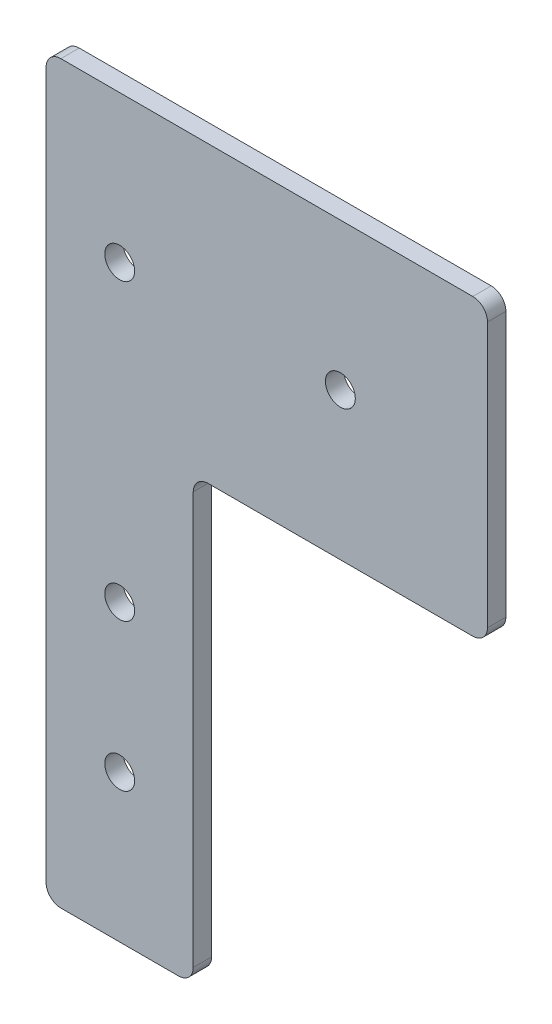
ISO-10303-21;
HEADER;
FILE_DESCRIPTION(('STEP AP214'),'2;1');
FILE_NAME('part.step','',(''),(''),'','','');
FILE_SCHEMA(('AUTOMOTIVE_DESIGN { 1 0 10303 214 1 1 1 1 }'));
ENDSEC;
DATA;
#1=APPLICATION_CONTEXT('core data for automotive mechanical design processes');
#2=APPLICATION_PROTOCOL_DEFINITION('international standard','automotive_design',2000,#1);
#3=PRODUCT_CONTEXT('',#1,'mechanical');
#4=PRODUCT('Part','Part','',(#3));
#5=PRODUCT_RELATED_PRODUCT_CATEGORY('part','',(#4));
#6=PRODUCT_DEFINITION_FORMATION('','',#4);
#7=PRODUCT_DEFINITION_CONTEXT('part definition',#1,'design');
#8=PRODUCT_DEFINITION('design','',#6,#7);
#9=PRODUCT_DEFINITION_SHAPE('','',#8);
#10=(LENGTH_UNIT() NAMED_UNIT(*) SI_UNIT(.MILLI.,.METRE.));
#11=(NAMED_UNIT(*) PLANE_ANGLE_UNIT() SI_UNIT($,.RADIAN.));
#12=(NAMED_UNIT(*) SI_UNIT($,.STERADIAN.) SOLID_ANGLE_UNIT());
#13=UNCERTAINTY_MEASURE_WITH_UNIT(LENGTH_MEASURE(1.E-05),#10,'distance_accuracy_value','');
#14=(GEOMETRIC_REPRESENTATION_CONTEXT(3) GLOBAL_UNCERTAINTY_ASSIGNED_CONTEXT((#13)) GLOBAL_UNIT_ASSIGNED_CONTEXT((#10,
#11,#12)) REPRESENTATION_CONTEXT('',''));
#15=CARTESIAN_POINT('',(0.,0.,0.));
#16=DIRECTION('',(0.,0.,1.));
#17=DIRECTION('',(1.,0.,0.));
#18=AXIS2_PLACEMENT_3D('',#15,#16,#17);
#19=CARTESIAN_POINT('',(-12.7,63.5,3.175));
#20=DIRECTION('',(0.,-1.,0.));
#21=DIRECTION('',(0.,0.,-1.));
#22=AXIS2_PLACEMENT_3D('',#19,#20,#21);
#23=PLANE('',#22);
#24=DIRECTION('',(-1.,0.,0.));
#25=VECTOR('',#24,1.);
#26=CARTESIAN_POINT('',(-12.7,63.5,0.));
#27=LINE('',#26,#25);
#28=CARTESIAN_POINT('',(60.96,63.5,0.));
#29=VERTEX_POINT('',#28);
#30=CARTESIAN_POINT('',(-10.16,63.5,0.));
#31=VERTEX_POINT('',#30);
#32=EDGE_CURVE('E149',#29,#31,#27,.T.);
#33=ORIENTED_EDGE('',*,*,#32,.T.);
#34=DIRECTION('',(0.,0.,-1.));
#35=VECTOR('',#34,1.);
#36=CARTESIAN_POINT('',(-10.16,63.5,3.175));
#37=LINE('',#36,#35);
#38=CARTESIAN_POINT('',(-10.16,63.5,3.175));
#39=VERTEX_POINT('',#38);
#40=EDGE_CURVE('E127',#31,#39,#37,.F.);
#41=ORIENTED_EDGE('',*,*,#40,.T.);
#42=DIRECTION('',(-1.,0.,0.));
#43=VECTOR('',#42,1.);
#44=CARTESIAN_POINT('',(12.7,63.5,3.175));
#45=LINE('',#44,#43);
#46=CARTESIAN_POINT('',(60.96,63.5,3.175));
#47=VERTEX_POINT('',#46);
#48=EDGE_CURVE('E165',#47,#39,#45,.T.);
#49=ORIENTED_EDGE('',*,*,#48,.F.);
#50=DIRECTION('',(0.,0.,-1.));
#51=VECTOR('',#50,1.);
#52=CARTESIAN_POINT('',(60.96,63.5,3.175));
#53=LINE('',#52,#51);
#54=EDGE_CURVE('E132',#47,#29,#53,.T.);
#55=ORIENTED_EDGE('',*,*,#54,.T.);
#56=EDGE_LOOP('',(#33,#41,#49,#55));
#57=FACE_BOUND('',#56,.T.);
#58=ADVANCED_FACE('F32',(#57),#23,.F.);
#59=CARTESIAN_POINT('',(-12.7,-63.5,3.175));
#60=DIRECTION('',(1.,0.,0.));
#61=DIRECTION('',(0.,0.,-1.));
#62=AXIS2_PLACEMENT_3D('',#59,#60,#61);
#63=PLANE('',#62);
#64=DIRECTION('',(0.,-1.,0.));
#65=VECTOR('',#64,1.);
#66=CARTESIAN_POINT('',(-12.7,-63.5,3.175));
#67=LINE('',#66,#65);
#68=CARTESIAN_POINT('',(-12.7,60.96,3.175));
#69=VERTEX_POINT('',#68);
#70=CARTESIAN_POINT('',(-12.7,-60.96,3.175));
#71=VERTEX_POINT('',#70);
#72=EDGE_CURVE('E142',#69,#71,#67,.T.);
#73=ORIENTED_EDGE('',*,*,#72,.F.);
#74=DIRECTION('',(0.,0.,-1.));
#75=VECTOR('',#74,1.);
#76=CARTESIAN_POINT('',(-12.7,60.96,3.175));
#77=LINE('',#76,#75);
#78=CARTESIAN_POINT('',(-12.7,60.96,0.));
#79=VERTEX_POINT('',#78);
#80=EDGE_CURVE('E126',#69,#79,#77,.T.);
#81=ORIENTED_EDGE('',*,*,#80,.T.);
#82=DIRECTION('',(0.,-1.,0.));
#83=VECTOR('',#82,1.);
#84=CARTESIAN_POINT('',(-12.7,-63.5,0.));
#85=LINE('',#84,#83);
#86=CARTESIAN_POINT('',(-12.7,-60.96,0.));
#87=VERTEX_POINT('',#86);
#88=EDGE_CURVE('E139',#79,#87,#85,.T.);
#89=ORIENTED_EDGE('',*,*,#88,.T.);
#90=DIRECTION('',(0.,0.,-1.));
#91=VECTOR('',#90,1.);
#92=CARTESIAN_POINT('',(-12.7,-60.96,3.175));
#93=LINE('',#92,#91);
#94=EDGE_CURVE('E144',#87,#71,#93,.F.);
#95=ORIENTED_EDGE('',*,*,#94,.T.);
#96=EDGE_LOOP('',(#73,#81,#89,#95));
#97=FACE_BOUND('',#96,.T.);
#98=ADVANCED_FACE('F138',(#97),#63,.F.);
#99=CARTESIAN_POINT('',(-12.7,-63.5,3.175));
#100=DIRECTION('',(0.,1.,0.));
#101=DIRECTION('',(0.,0.,1.));
#102=AXIS2_PLACEMENT_3D('',#99,#100,#101);
#103=PLANE('',#102);
#104=DIRECTION('',(1.,0.,0.));
#105=VECTOR('',#104,1.);
#106=CARTESIAN_POINT('',(-12.7,-63.5,3.175));
#107=LINE('',#106,#105);
#108=CARTESIAN_POINT('',(-10.16,-63.5,3.175));
#109=VERTEX_POINT('',#108);
#110=CARTESIAN_POINT('',(10.16,-63.5,3.175));
#111=VERTEX_POINT('',#110);
#112=EDGE_CURVE('E225',#109,#111,#107,.T.);
#113=ORIENTED_EDGE('',*,*,#112,.F.);
#114=DIRECTION('',(0.,0.,-1.));
#115=VECTOR('',#114,1.);
#116=CARTESIAN_POINT('',(-10.16,-63.5,3.175));
#117=LINE('',#116,#115);
#118=CARTESIAN_POINT('',(-10.16,-63.5,0.));
#119=VERTEX_POINT('',#118);
#120=EDGE_CURVE('E188',#109,#119,#117,.T.);
#121=ORIENTED_EDGE('',*,*,#120,.T.);
#122=DIRECTION('',(1.,0.,0.));
#123=VECTOR('',#122,1.);
#124=CARTESIAN_POINT('',(-12.7,-63.5,0.));
#125=LINE('',#124,#123);
#126=CARTESIAN_POINT('',(10.16,-63.5,0.));
#127=VERTEX_POINT('',#126);
#128=EDGE_CURVE('E148',#119,#127,#125,.T.);
#129=ORIENTED_EDGE('',*,*,#128,.T.);
#130=DIRECTION('',(0.,0.,-1.));
#131=VECTOR('',#130,1.);
#132=CARTESIAN_POINT('',(10.16,-63.5,3.175));
#133=LINE('',#132,#131);
#134=EDGE_CURVE('E186',#127,#111,#133,.F.);
#135=ORIENTED_EDGE('',*,*,#134,.T.);
#136=EDGE_LOOP('',(#113,#121,#129,#135));
#137=FACE_BOUND('',#136,.T.);
#138=ADVANCED_FACE('F294',(#137),#103,.F.);
#139=CARTESIAN_POINT('',(12.7,-63.5,3.175));
#140=DIRECTION('',(-1.,0.,0.));
#141=DIRECTION('',(0.,-1.,0.));
#142=AXIS2_PLACEMENT_3D('',#139,#140,#141);
#143=PLANE('',#142);
#144=DIRECTION('',(0.,1.,0.));
#145=VECTOR('',#144,1.);
#146=CARTESIAN_POINT('',(12.7,-63.5,3.175));
#147=LINE('',#146,#145);
#148=CARTESIAN_POINT('',(12.7,-60.96,3.175));
#149=VERTEX_POINT('',#148);
#150=CARTESIAN_POINT('',(12.7,10.16,3.175));
#151=VERTEX_POINT('',#150);
#152=EDGE_CURVE('E220',#149,#151,#147,.T.);
#153=ORIENTED_EDGE('',*,*,#152,.F.);
#154=DIRECTION('',(0.,0.,-1.));
#155=VECTOR('',#154,1.);
#156=CARTESIAN_POINT('',(12.7,-60.96,3.175));
#157=LINE('',#156,#155);
#158=CARTESIAN_POINT('',(12.7,-60.96,0.));
#159=VERTEX_POINT('',#158);
#160=EDGE_CURVE('E193',#149,#159,#157,.T.);
#161=ORIENTED_EDGE('',*,*,#160,.T.);
#162=DIRECTION('',(0.,1.,0.));
#163=VECTOR('',#162,1.);
#164=CARTESIAN_POINT('',(12.7,-63.5,0.));
#165=LINE('',#164,#163);
#166=CARTESIAN_POINT('',(12.7,10.16,0.));
#167=VERTEX_POINT('',#166);
#168=EDGE_CURVE('E152',#159,#167,#165,.T.);
#169=ORIENTED_EDGE('',*,*,#168,.T.);
#170=DIRECTION('',(0.,0.,-1.));
#171=VECTOR('',#170,1.);
#172=CARTESIAN_POINT('',(12.7,10.16,3.175));
#173=LINE('',#172,#171);
#174=EDGE_CURVE('E191',#167,#151,#173,.F.);
#175=ORIENTED_EDGE('',*,*,#174,.T.);
#176=EDGE_LOOP('',(#153,#161,#169,#175));
#177=FACE_BOUND('',#176,.T.);
#178=ADVANCED_FACE('F211',(#177),#143,.F.);
#179=CARTESIAN_POINT('',(12.7,12.7,3.175));
#180=DIRECTION('',(0.,1.,0.));
#181=DIRECTION('',(0.,0.,1.));
#182=AXIS2_PLACEMENT_3D('',#179,#180,#181);
#183=PLANE('',#182);
#184=DIRECTION('',(1.,0.,0.));
#185=VECTOR('',#184,1.);
#186=CARTESIAN_POINT('',(12.7,12.7,3.175));
#187=LINE('',#186,#185);
#188=CARTESIAN_POINT('',(15.24,12.7,3.175));
#189=VERTEX_POINT('',#188);
#190=CARTESIAN_POINT('',(60.96,12.7,3.175));
#191=VERTEX_POINT('',#190);
#192=EDGE_CURVE('E219',#189,#191,#187,.T.);
#193=ORIENTED_EDGE('',*,*,#192,.F.);
#194=DIRECTION('',(0.,0.,-1.));
#195=VECTOR('',#194,1.);
#196=CARTESIAN_POINT('',(15.24,12.7,0.));
#197=LINE('',#196,#195);
#198=CARTESIAN_POINT('',(15.24,12.7,0.));
#199=VERTEX_POINT('',#198);
#200=EDGE_CURVE('E198',#189,#199,#197,.T.);
#201=ORIENTED_EDGE('',*,*,#200,.T.);
#202=DIRECTION('',(1.,0.,0.));
#203=VECTOR('',#202,1.);
#204=CARTESIAN_POINT('',(12.7,12.7,0.));
#205=LINE('',#204,#203);
#206=CARTESIAN_POINT('',(60.96,12.7,0.));
#207=VERTEX_POINT('',#206);
#208=EDGE_CURVE('E160',#199,#207,#205,.T.);
#209=ORIENTED_EDGE('',*,*,#208,.T.);
#210=DIRECTION('',(0.,0.,-1.));
#211=VECTOR('',#210,1.);
#212=CARTESIAN_POINT('',(60.96,12.7,3.175));
#213=LINE('',#212,#211);
#214=EDGE_CURVE('E196',#207,#191,#213,.F.);
#215=ORIENTED_EDGE('',*,*,#214,.T.);
#216=EDGE_LOOP('',(#193,#201,#209,#215));
#217=FACE_BOUND('',#216,.T.);
#218=ADVANCED_FACE('F222',(#217),#183,.F.);
#219=CARTESIAN_POINT('',(63.5,63.5,3.175));
#220=DIRECTION('',(-1.,0.,0.));
#221=DIRECTION('',(0.,0.,1.));
#222=AXIS2_PLACEMENT_3D('',#219,#220,#221);
#223=PLANE('',#222);
#224=DIRECTION('',(0.,1.,0.));
#225=VECTOR('',#224,1.);
#226=CARTESIAN_POINT('',(63.5,63.5,3.175));
#227=LINE('',#226,#225);
#228=CARTESIAN_POINT('',(63.5,15.24,3.175));
#229=VERTEX_POINT('',#228);
#230=CARTESIAN_POINT('',(63.5,60.96,3.175));
#231=VERTEX_POINT('',#230);
#232=EDGE_CURVE('E166',#229,#231,#227,.T.);
#233=ORIENTED_EDGE('',*,*,#232,.F.);
#234=DIRECTION('',(0.,0.,-1.));
#235=VECTOR('',#234,1.);
#236=CARTESIAN_POINT('',(63.5,15.24,3.175));
#237=LINE('',#236,#235);
#238=CARTESIAN_POINT('',(63.5,15.24,0.));
#239=VERTEX_POINT('',#238);
#240=EDGE_CURVE('E202',#229,#239,#237,.T.);
#241=ORIENTED_EDGE('',*,*,#240,.T.);
#242=DIRECTION('',(0.,1.,0.));
#243=VECTOR('',#242,1.);
#244=CARTESIAN_POINT('',(63.5,63.5,0.));
#245=LINE('',#244,#243);
#246=CARTESIAN_POINT('',(63.5,60.96,0.));
#247=VERTEX_POINT('',#246);
#248=EDGE_CURVE('E163',#239,#247,#245,.T.);
#249=ORIENTED_EDGE('',*,*,#248,.T.);
#250=DIRECTION('',(0.,0.,-1.));
#251=VECTOR('',#250,1.);
#252=CARTESIAN_POINT('',(63.5,60.96,3.175));
#253=LINE('',#252,#251);
#254=EDGE_CURVE('E47',#247,#231,#253,.F.);
#255=ORIENTED_EDGE('',*,*,#254,.T.);
#256=EDGE_LOOP('',(#233,#241,#249,#255));
#257=FACE_BOUND('',#256,.T.);
#258=ADVANCED_FACE('F267',(#257),#223,.F.);
#259=CARTESIAN_POINT('',(0.,0.,3.175));
#260=DIRECTION('',(0.,0.,-1.));
#261=DIRECTION('',(-1.,0.,0.));
#262=AXIS2_PLACEMENT_3D('',#259,#260,#261);
#263=PLANE('',#262);
#264=CARTESIAN_POINT('',(38.1,38.1,3.175));
#265=DIRECTION('',(0.,0.,1.));
#266=DIRECTION('',(1.,0.,0.));
#267=AXIS2_PLACEMENT_3D('',#264,#265,#266);
#268=CIRCLE('',#267,2.5796875);
#269=CARTESIAN_POINT('',(40.6796875,38.1,3.175));
#270=VERTEX_POINT('',#269);
#271=EDGE_CURVE('E250',#270,#270,#268,.T.);
#272=ORIENTED_EDGE('',*,*,#271,.F.);
#273=EDGE_LOOP('',(#272));
#274=FACE_BOUND('',#273,.T.);
#275=CARTESIAN_POINT('',(0.,-38.1,3.175));
#276=DIRECTION('',(0.,0.,1.));
#277=DIRECTION('',(1.,0.,0.));
#278=AXIS2_PLACEMENT_3D('',#275,#276,#277);
#279=CIRCLE('',#278,2.5796875);
#280=CARTESIAN_POINT('',(2.5796875,-38.1,3.175));
#281=VERTEX_POINT('',#280);
#282=EDGE_CURVE('E244',#281,#281,#279,.T.);
#283=ORIENTED_EDGE('',*,*,#282,.F.);
#284=EDGE_LOOP('',(#283));
#285=FACE_BOUND('',#284,.T.);
#286=CARTESIAN_POINT('',(0.,-12.7,3.175));
#287=DIRECTION('',(0.,0.,1.));
#288=DIRECTION('',(1.,0.,0.));
#289=AXIS2_PLACEMENT_3D('',#286,#287,#288);
#290=CIRCLE('',#289,2.5796875);
#291=CARTESIAN_POINT('',(2.5796875,-12.7,3.175));
#292=VERTEX_POINT('',#291);
#293=EDGE_CURVE('E238',#292,#292,#290,.T.);
#294=ORIENTED_EDGE('',*,*,#293,.F.);
#295=EDGE_LOOP('',(#294));
#296=FACE_BOUND('',#295,.T.);
#297=CARTESIAN_POINT('',(0.,38.1,3.175));
#298=DIRECTION('',(0.,0.,1.));
#299=DIRECTION('',(1.,0.,0.));
#300=AXIS2_PLACEMENT_3D('',#297,#298,#299);
#301=CIRCLE('',#300,2.5796875);
#302=CARTESIAN_POINT('',(2.5796875,38.1,3.175));
#303=VERTEX_POINT('',#302);
#304=EDGE_CURVE('E232',#303,#303,#301,.T.);
#305=ORIENTED_EDGE('',*,*,#304,.F.);
#306=EDGE_LOOP('',(#305));
#307=FACE_BOUND('',#306,.T.);
#308=ORIENTED_EDGE('',*,*,#48,.T.);
#309=CARTESIAN_POINT('',(-10.16,60.96,3.175));
#310=DIRECTION('',(0.,0.,-1.));
#311=DIRECTION('',(-1.,0.,0.));
#312=AXIS2_PLACEMENT_3D('',#309,#310,#311);
#313=CIRCLE('',#312,2.54);
#314=EDGE_CURVE('E184',#39,#69,#313,.F.);
#315=ORIENTED_EDGE('',*,*,#314,.T.);
#316=ORIENTED_EDGE('',*,*,#72,.T.);
#317=CARTESIAN_POINT('',(-10.16,-60.96,3.175));
#318=DIRECTION('',(0.,0.,-1.));
#319=DIRECTION('',(-1.,0.,0.));
#320=AXIS2_PLACEMENT_3D('',#317,#318,#319);
#321=CIRCLE('',#320,2.54);
#322=EDGE_CURVE('E182',#71,#109,#321,.F.);
#323=ORIENTED_EDGE('',*,*,#322,.T.);
#324=ORIENTED_EDGE('',*,*,#112,.T.);
#325=CARTESIAN_POINT('',(10.16,-60.96,3.175));
#326=DIRECTION('',(0.,0.,-1.));
#327=DIRECTION('',(-1.,0.,0.));
#328=AXIS2_PLACEMENT_3D('',#325,#326,#327);
#329=CIRCLE('',#328,2.54);
#330=EDGE_CURVE('E180',#111,#149,#329,.F.);
#331=ORIENTED_EDGE('',*,*,#330,.T.);
#332=ORIENTED_EDGE('',*,*,#152,.T.);
#333=CARTESIAN_POINT('',(15.24,10.16,3.175));
#334=DIRECTION('',(0.,0.,-1.));
#335=DIRECTION('',(-1.,0.,0.));
#336=AXIS2_PLACEMENT_3D('',#333,#334,#335);
#337=CIRCLE('',#336,2.54);
#338=EDGE_CURVE('E11',#151,#189,#337,.T.);
#339=ORIENTED_EDGE('',*,*,#338,.T.);
#340=ORIENTED_EDGE('',*,*,#192,.T.);
#341=CARTESIAN_POINT('',(60.96,15.24,3.175));
#342=DIRECTION('',(0.,0.,-1.));
#343=DIRECTION('',(-1.,0.,0.));
#344=AXIS2_PLACEMENT_3D('',#341,#342,#343);
#345=CIRCLE('',#344,2.54);
#346=EDGE_CURVE('E54',#191,#229,#345,.F.);
#347=ORIENTED_EDGE('',*,*,#346,.T.);
#348=ORIENTED_EDGE('',*,*,#232,.T.);
#349=CARTESIAN_POINT('',(60.96,60.96,3.175));
#350=DIRECTION('',(0.,0.,-1.));
#351=DIRECTION('',(-1.,0.,0.));
#352=AXIS2_PLACEMENT_3D('',#349,#350,#351);
#353=CIRCLE('',#352,2.54);
#354=EDGE_CURVE('E177',#231,#47,#353,.F.);
#355=ORIENTED_EDGE('',*,*,#354,.T.);
#356=EDGE_LOOP('',(#308,#315,#316,#323,#324,#331,#332,#339,#340,#347,#348,#355));
#357=FACE_BOUND('',#356,.T.);
#358=ADVANCED_FACE('F218',(#274,#285,#296,#307,#357),#263,.F.);
#359=CARTESIAN_POINT('',(0.,0.,0.));
#360=DIRECTION('',(0.,0.,-1.));
#361=DIRECTION('',(-1.,0.,0.));
#362=AXIS2_PLACEMENT_3D('',#359,#360,#361);
#363=PLANE('',#362);
#364=CARTESIAN_POINT('',(38.1,38.1,0.));
#365=DIRECTION('',(0.,0.,1.));
#366=DIRECTION('',(1.,0.,0.));
#367=AXIS2_PLACEMENT_3D('',#364,#365,#366);
#368=CIRCLE('',#367,2.5796875);
#369=CARTESIAN_POINT('',(40.6796875,38.1,0.));
#370=VERTEX_POINT('',#369);
#371=EDGE_CURVE('E235',#370,#370,#368,.T.);
#372=ORIENTED_EDGE('',*,*,#371,.T.);
#373=EDGE_LOOP('',(#372));
#374=FACE_BOUND('',#373,.T.);
#375=CARTESIAN_POINT('',(0.,-38.1,0.));
#376=DIRECTION('',(0.,0.,1.));
#377=DIRECTION('',(1.,0.,0.));
#378=AXIS2_PLACEMENT_3D('',#375,#376,#377);
#379=CIRCLE('',#378,2.5796875);
#380=CARTESIAN_POINT('',(2.5796875,-38.1,0.));
#381=VERTEX_POINT('',#380);
#382=EDGE_CURVE('E247',#381,#381,#379,.T.);
#383=ORIENTED_EDGE('',*,*,#382,.T.);
#384=EDGE_LOOP('',(#383));
#385=FACE_BOUND('',#384,.T.);
#386=CARTESIAN_POINT('',(0.,-12.7,0.));
#387=DIRECTION('',(0.,0.,1.));
#388=DIRECTION('',(1.,0.,0.));
#389=AXIS2_PLACEMENT_3D('',#386,#387,#388);
#390=CIRCLE('',#389,2.5796875);
#391=CARTESIAN_POINT('',(2.5796875,-12.7,0.));
#392=VERTEX_POINT('',#391);
#393=EDGE_CURVE('E241',#392,#392,#390,.T.);
#394=ORIENTED_EDGE('',*,*,#393,.T.);
#395=EDGE_LOOP('',(#394));
#396=FACE_BOUND('',#395,.T.);
#397=CARTESIAN_POINT('',(0.,38.1,0.));
#398=DIRECTION('',(0.,0.,1.));
#399=DIRECTION('',(1.,0.,0.));
#400=AXIS2_PLACEMENT_3D('',#397,#398,#399);
#401=CIRCLE('',#400,2.5796875);
#402=CARTESIAN_POINT('',(2.5796875,38.1,0.));
#403=VERTEX_POINT('',#402);
#404=EDGE_CURVE('E154',#403,#403,#401,.T.);
#405=ORIENTED_EDGE('',*,*,#404,.T.);
#406=EDGE_LOOP('',(#405));
#407=FACE_BOUND('',#406,.T.);
#408=ORIENTED_EDGE('',*,*,#88,.F.);
#409=CARTESIAN_POINT('',(-10.16,60.96,0.));
#410=DIRECTION('',(0.,0.,-1.));
#411=DIRECTION('',(-1.,0.,0.));
#412=AXIS2_PLACEMENT_3D('',#409,#410,#411);
#413=CIRCLE('',#412,2.54);
#414=EDGE_CURVE('E122',#79,#31,#413,.T.);
#415=ORIENTED_EDGE('',*,*,#414,.T.);
#416=ORIENTED_EDGE('',*,*,#32,.F.);
#417=CARTESIAN_POINT('',(60.96,60.96,0.));
#418=DIRECTION('',(0.,0.,-1.));
#419=DIRECTION('',(-1.,0.,0.));
#420=AXIS2_PLACEMENT_3D('',#417,#418,#419);
#421=CIRCLE('',#420,2.54);
#422=EDGE_CURVE('E143',#29,#247,#421,.T.);
#423=ORIENTED_EDGE('',*,*,#422,.T.);
#424=ORIENTED_EDGE('',*,*,#248,.F.);
#425=CARTESIAN_POINT('',(60.96,15.24,0.));
#426=DIRECTION('',(0.,0.,-1.));
#427=DIRECTION('',(-1.,0.,0.));
#428=AXIS2_PLACEMENT_3D('',#425,#426,#427);
#429=CIRCLE('',#428,2.54);
#430=EDGE_CURVE('E169',#239,#207,#429,.T.);
#431=ORIENTED_EDGE('',*,*,#430,.T.);
#432=ORIENTED_EDGE('',*,*,#208,.F.);
#433=CARTESIAN_POINT('',(15.24,10.16,0.));
#434=DIRECTION('',(0.,0.,-1.));
#435=DIRECTION('',(-1.,0.,0.));
#436=AXIS2_PLACEMENT_3D('',#433,#434,#435);
#437=CIRCLE('',#436,2.54);
#438=EDGE_CURVE('E40',#199,#167,#437,.F.);
#439=ORIENTED_EDGE('',*,*,#438,.T.);
#440=ORIENTED_EDGE('',*,*,#168,.F.);
#441=CARTESIAN_POINT('',(10.16,-60.96,0.));
#442=DIRECTION('',(0.,0.,-1.));
#443=DIRECTION('',(-1.,0.,0.));
#444=AXIS2_PLACEMENT_3D('',#441,#442,#443);
#445=CIRCLE('',#444,2.54);
#446=EDGE_CURVE('E171',#159,#127,#445,.T.);
#447=ORIENTED_EDGE('',*,*,#446,.T.);
#448=ORIENTED_EDGE('',*,*,#128,.F.);
#449=CARTESIAN_POINT('',(-10.16,-60.96,0.));
#450=DIRECTION('',(0.,0.,-1.));
#451=DIRECTION('',(-1.,0.,0.));
#452=AXIS2_PLACEMENT_3D('',#449,#450,#451);
#453=CIRCLE('',#452,2.54);
#454=EDGE_CURVE('E133',#119,#87,#453,.T.);
#455=ORIENTED_EDGE('',*,*,#454,.T.);
#456=EDGE_LOOP('',(#408,#415,#416,#423,#424,#431,#432,#439,#440,#447,#448,#455));
#457=FACE_BOUND('',#456,.T.);
#458=ADVANCED_FACE('F146',(#374,#385,#396,#407,#457),#363,.T.);
#459=CARTESIAN_POINT('',(0.,38.1,0.));
#460=DIRECTION('',(0.,0.,1.));
#461=DIRECTION('',(1.,0.,0.));
#462=AXIS2_PLACEMENT_3D('',#459,#460,#461);
#463=CYLINDRICAL_SURFACE('',#462,2.5796875);
#464=ORIENTED_EDGE('',*,*,#404,.F.);
#465=EDGE_LOOP('',(#464));
#466=FACE_BOUND('',#465,.T.);
#467=ORIENTED_EDGE('',*,*,#304,.T.);
#468=EDGE_LOOP('',(#467));
#469=FACE_BOUND('',#468,.T.);
#470=ADVANCED_FACE('F275',(#466,#469),#463,.F.);
#471=CARTESIAN_POINT('',(0.,-12.7,0.));
#472=DIRECTION('',(0.,0.,1.));
#473=DIRECTION('',(1.,0.,0.));
#474=AXIS2_PLACEMENT_3D('',#471,#472,#473);
#475=CYLINDRICAL_SURFACE('',#474,2.5796875);
#476=ORIENTED_EDGE('',*,*,#393,.F.);
#477=EDGE_LOOP('',(#476));
#478=FACE_BOUND('',#477,.T.);
#479=ORIENTED_EDGE('',*,*,#293,.T.);
#480=EDGE_LOOP('',(#479));
#481=FACE_BOUND('',#480,.T.);
#482=ADVANCED_FACE('F277',(#478,#481),#475,.F.);
#483=CARTESIAN_POINT('',(0.,-38.1,0.));
#484=DIRECTION('',(0.,0.,1.));
#485=DIRECTION('',(1.,0.,0.));
#486=AXIS2_PLACEMENT_3D('',#483,#484,#485);
#487=CYLINDRICAL_SURFACE('',#486,2.5796875);
#488=ORIENTED_EDGE('',*,*,#382,.F.);
#489=EDGE_LOOP('',(#488));
#490=FACE_BOUND('',#489,.T.);
#491=ORIENTED_EDGE('',*,*,#282,.T.);
#492=EDGE_LOOP('',(#491));
#493=FACE_BOUND('',#492,.T.);
#494=ADVANCED_FACE('F261',(#490,#493),#487,.F.);
#495=CARTESIAN_POINT('',(38.1,38.1,0.));
#496=DIRECTION('',(0.,0.,1.));
#497=DIRECTION('',(1.,0.,0.));
#498=AXIS2_PLACEMENT_3D('',#495,#496,#497);
#499=CYLINDRICAL_SURFACE('',#498,2.5796875);
#500=ORIENTED_EDGE('',*,*,#371,.F.);
#501=EDGE_LOOP('',(#500));
#502=FACE_BOUND('',#501,.T.);
#503=ORIENTED_EDGE('',*,*,#271,.T.);
#504=EDGE_LOOP('',(#503));
#505=FACE_BOUND('',#504,.T.);
#506=ADVANCED_FACE('F258',(#502,#505),#499,.F.);
#507=CARTESIAN_POINT('',(-10.16,60.96,3.175));
#508=DIRECTION('',(0.,0.,-1.));
#509=DIRECTION('',(-1.,0.,0.));
#510=AXIS2_PLACEMENT_3D('',#507,#508,#509);
#511=CYLINDRICAL_SURFACE('',#510,2.54);
#512=ORIENTED_EDGE('',*,*,#314,.F.);
#513=ORIENTED_EDGE('',*,*,#40,.F.);
#514=ORIENTED_EDGE('',*,*,#414,.F.);
#515=ORIENTED_EDGE('',*,*,#80,.F.);
#516=EDGE_LOOP('',(#512,#513,#514,#515));
#517=FACE_BOUND('',#516,.T.);
#518=ADVANCED_FACE('F125',(#517),#511,.T.);
#519=CARTESIAN_POINT('',(-10.16,-60.96,3.175));
#520=DIRECTION('',(0.,0.,-1.));
#521=DIRECTION('',(-1.,0.,0.));
#522=AXIS2_PLACEMENT_3D('',#519,#520,#521);
#523=CYLINDRICAL_SURFACE('',#522,2.54);
#524=ORIENTED_EDGE('',*,*,#322,.F.);
#525=ORIENTED_EDGE('',*,*,#94,.F.);
#526=ORIENTED_EDGE('',*,*,#454,.F.);
#527=ORIENTED_EDGE('',*,*,#120,.F.);
#528=EDGE_LOOP('',(#524,#525,#526,#527));
#529=FACE_BOUND('',#528,.T.);
#530=ADVANCED_FACE('F300',(#529),#523,.T.);
#531=CARTESIAN_POINT('',(10.16,-60.96,3.175));
#532=DIRECTION('',(0.,0.,-1.));
#533=DIRECTION('',(-1.,0.,0.));
#534=AXIS2_PLACEMENT_3D('',#531,#532,#533);
#535=CYLINDRICAL_SURFACE('',#534,2.54);
#536=ORIENTED_EDGE('',*,*,#330,.F.);
#537=ORIENTED_EDGE('',*,*,#134,.F.);
#538=ORIENTED_EDGE('',*,*,#446,.F.);
#539=ORIENTED_EDGE('',*,*,#160,.F.);
#540=EDGE_LOOP('',(#536,#537,#538,#539));
#541=FACE_BOUND('',#540,.T.);
#542=ADVANCED_FACE('F303',(#541),#535,.T.);
#543=CARTESIAN_POINT('',(15.24,10.16,3.175));
#544=DIRECTION('',(0.,0.,1.));
#545=DIRECTION('',(1.,0.,0.));
#546=AXIS2_PLACEMENT_3D('',#543,#544,#545);
#547=CYLINDRICAL_SURFACE('',#546,2.54);
#548=ORIENTED_EDGE('',*,*,#338,.F.);
#549=ORIENTED_EDGE('',*,*,#174,.F.);
#550=ORIENTED_EDGE('',*,*,#438,.F.);
#551=ORIENTED_EDGE('',*,*,#200,.F.);
#552=EDGE_LOOP('',(#548,#549,#550,#551));
#553=FACE_BOUND('',#552,.T.);
#554=ADVANCED_FACE('F215',(#553),#547,.F.);
#555=CARTESIAN_POINT('',(60.96,15.24,3.175));
#556=DIRECTION('',(0.,0.,-1.));
#557=DIRECTION('',(-1.,0.,0.));
#558=AXIS2_PLACEMENT_3D('',#555,#556,#557);
#559=CYLINDRICAL_SURFACE('',#558,2.54);
#560=ORIENTED_EDGE('',*,*,#346,.F.);
#561=ORIENTED_EDGE('',*,*,#214,.F.);
#562=ORIENTED_EDGE('',*,*,#430,.F.);
#563=ORIENTED_EDGE('',*,*,#240,.F.);
#564=EDGE_LOOP('',(#560,#561,#562,#563));
#565=FACE_BOUND('',#564,.T.);
#566=ADVANCED_FACE('F309',(#565),#559,.T.);
#567=CARTESIAN_POINT('',(60.96,60.96,3.175));
#568=DIRECTION('',(0.,0.,-1.));
#569=DIRECTION('',(-1.,0.,0.));
#570=AXIS2_PLACEMENT_3D('',#567,#568,#569);
#571=CYLINDRICAL_SURFACE('',#570,2.54);
#572=ORIENTED_EDGE('',*,*,#354,.F.);
#573=ORIENTED_EDGE('',*,*,#254,.F.);
#574=ORIENTED_EDGE('',*,*,#422,.F.);
#575=ORIENTED_EDGE('',*,*,#54,.F.);
#576=EDGE_LOOP('',(#572,#573,#574,#575));
#577=FACE_BOUND('',#576,.T.);
#578=ADVANCED_FACE('F34',(#577),#571,.T.);
#579=CLOSED_SHELL('',(#58,#98,#138,#178,#218,#258,#358,#458,#470,#482,#494,#506,#518,#530,#542,
#554,#566,#578));
#580=MANIFOLD_SOLID_BREP('B2',#579);
#581=ADVANCED_BREP_SHAPE_REPRESENTATION('',(#18,#580),#14);
#582=SHAPE_DEFINITION_REPRESENTATION(#9,#581);
ENDSEC;
END-ISO-10303-21;
